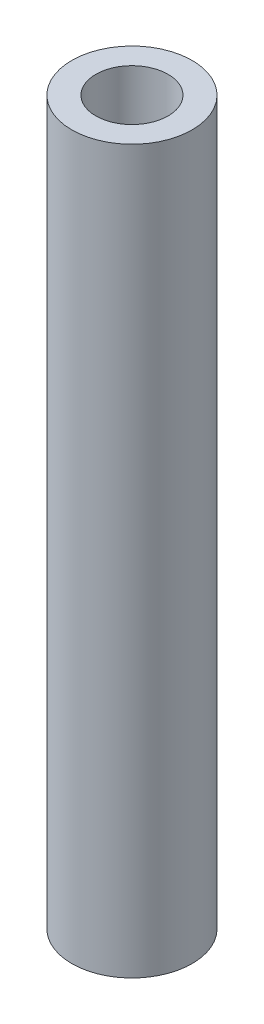
ISO-10303-21;
HEADER;
FILE_DESCRIPTION(('STEP AP214'),'2;1');
FILE_NAME('part.step','',(''),(''),'','','');
FILE_SCHEMA(('AUTOMOTIVE_DESIGN { 1 0 10303 214 1 1 1 1 }'));
ENDSEC;
DATA;
#1=APPLICATION_CONTEXT('core data for automotive mechanical design processes');
#2=APPLICATION_PROTOCOL_DEFINITION('international standard','automotive_design',2000,#1);
#3=PRODUCT_CONTEXT('',#1,'mechanical');
#4=PRODUCT('Part','Part','',(#3));
#5=PRODUCT_RELATED_PRODUCT_CATEGORY('part','',(#4));
#6=PRODUCT_DEFINITION_FORMATION('','',#4);
#7=PRODUCT_DEFINITION_CONTEXT('part definition',#1,'design');
#8=PRODUCT_DEFINITION('design','',#6,#7);
#9=PRODUCT_DEFINITION_SHAPE('','',#8);
#10=(LENGTH_UNIT() NAMED_UNIT(*) SI_UNIT(.MILLI.,.METRE.));
#11=(NAMED_UNIT(*) PLANE_ANGLE_UNIT() SI_UNIT($,.RADIAN.));
#12=(NAMED_UNIT(*) SI_UNIT($,.STERADIAN.) SOLID_ANGLE_UNIT());
#13=UNCERTAINTY_MEASURE_WITH_UNIT(LENGTH_MEASURE(1.E-05),#10,'distance_accuracy_value','');
#14=(GEOMETRIC_REPRESENTATION_CONTEXT(3) GLOBAL_UNCERTAINTY_ASSIGNED_CONTEXT((#13)) GLOBAL_UNIT_ASSIGNED_CONTEXT((#10,
#11,#12)) REPRESENTATION_CONTEXT('',''));
#15=CARTESIAN_POINT('',(0.,0.,0.));
#16=DIRECTION('',(0.,0.,1.));
#17=DIRECTION('',(1.,0.,0.));
#18=AXIS2_PLACEMENT_3D('',#15,#16,#17);
#19=CARTESIAN_POINT('',(0.,15.,0.));
#20=DIRECTION('',(0.,1.,0.));
#21=DIRECTION('',(0.,0.,1.));
#22=AXIS2_PLACEMENT_3D('',#19,#20,#21);
#23=PLANE('',#22);
#24=CARTESIAN_POINT('',(0.,15.,0.));
#25=DIRECTION('',(0.,1.,0.));
#26=DIRECTION('',(0.,0.,1.));
#27=AXIS2_PLACEMENT_3D('',#24,#25,#26);
#28=CIRCLE('',#27,2.5);
#29=CARTESIAN_POINT('',(0.,15.,2.5));
#30=VERTEX_POINT('',#29);
#31=EDGE_CURVE('E10',#30,#30,#28,.T.);
#32=ORIENTED_EDGE('',*,*,#31,.T.);
#33=EDGE_LOOP('',(#32));
#34=FACE_BOUND('',#33,.T.);
#35=CARTESIAN_POINT('',(0.,15.,0.));
#36=DIRECTION('',(0.,1.,0.));
#37=DIRECTION('',(0.,0.,1.));
#38=AXIS2_PLACEMENT_3D('',#35,#36,#37);
#39=CIRCLE('',#38,1.5);
#40=CARTESIAN_POINT('',(0.,15.,1.5));
#41=VERTEX_POINT('',#40);
#42=EDGE_CURVE('E43',#41,#41,#39,.T.);
#43=ORIENTED_EDGE('',*,*,#42,.F.);
#44=EDGE_LOOP('',(#43));
#45=FACE_BOUND('',#44,.T.);
#46=ADVANCED_FACE('F32',(#34,#45),#23,.T.);
#47=CARTESIAN_POINT('',(0.,-15.,0.));
#48=DIRECTION('',(0.,1.,0.));
#49=DIRECTION('',(0.,0.,1.));
#50=AXIS2_PLACEMENT_3D('',#47,#48,#49);
#51=PLANE('',#50);
#52=CARTESIAN_POINT('',(0.,-15.,0.));
#53=DIRECTION('',(0.,1.,0.));
#54=DIRECTION('',(0.,0.,1.));
#55=AXIS2_PLACEMENT_3D('',#52,#53,#54);
#56=CIRCLE('',#55,2.5);
#57=CARTESIAN_POINT('',(0.,-15.,2.5));
#58=VERTEX_POINT('',#57);
#59=EDGE_CURVE('E36',#58,#58,#56,.T.);
#60=ORIENTED_EDGE('',*,*,#59,.F.);
#61=EDGE_LOOP('',(#60));
#62=FACE_BOUND('',#61,.T.);
#63=CARTESIAN_POINT('',(0.,-15.,0.));
#64=DIRECTION('',(0.,1.,0.));
#65=DIRECTION('',(0.,0.,1.));
#66=AXIS2_PLACEMENT_3D('',#63,#64,#65);
#67=CIRCLE('',#66,1.5);
#68=CARTESIAN_POINT('',(0.,-15.,1.5));
#69=VERTEX_POINT('',#68);
#70=EDGE_CURVE('E45',#69,#69,#67,.T.);
#71=ORIENTED_EDGE('',*,*,#70,.T.);
#72=EDGE_LOOP('',(#71));
#73=FACE_BOUND('',#72,.T.);
#74=ADVANCED_FACE('F55',(#62,#73),#51,.F.);
#75=CARTESIAN_POINT('',(0.,15.,0.));
#76=DIRECTION('',(0.,-1.,0.));
#77=DIRECTION('',(0.,0.,-1.));
#78=AXIS2_PLACEMENT_3D('',#75,#76,#77);
#79=CYLINDRICAL_SURFACE('',#78,2.5);
#80=ORIENTED_EDGE('',*,*,#31,.F.);
#81=EDGE_LOOP('',(#80));
#82=FACE_BOUND('',#81,.T.);
#83=ORIENTED_EDGE('',*,*,#59,.T.);
#84=EDGE_LOOP('',(#83));
#85=FACE_BOUND('',#84,.T.);
#86=ADVANCED_FACE('F34',(#82,#85),#79,.T.);
#87=CARTESIAN_POINT('',(0.,15.,0.));
#88=DIRECTION('',(0.,-1.,0.));
#89=DIRECTION('',(0.,0.,-1.));
#90=AXIS2_PLACEMENT_3D('',#87,#88,#89);
#91=CYLINDRICAL_SURFACE('',#90,1.5);
#92=ORIENTED_EDGE('',*,*,#42,.T.);
#93=EDGE_LOOP('',(#92));
#94=FACE_BOUND('',#93,.T.);
#95=ORIENTED_EDGE('',*,*,#70,.F.);
#96=EDGE_LOOP('',(#95));
#97=FACE_BOUND('',#96,.T.);
#98=ADVANCED_FACE('F51',(#94,#97),#91,.F.);
#99=CLOSED_SHELL('',(#46,#74,#86,#98));
#100=MANIFOLD_SOLID_BREP('B2',#99);
#101=ADVANCED_BREP_SHAPE_REPRESENTATION('',(#18,#100),#14);
#102=SHAPE_DEFINITION_REPRESENTATION(#9,#101);
ENDSEC;
END-ISO-10303-21;
